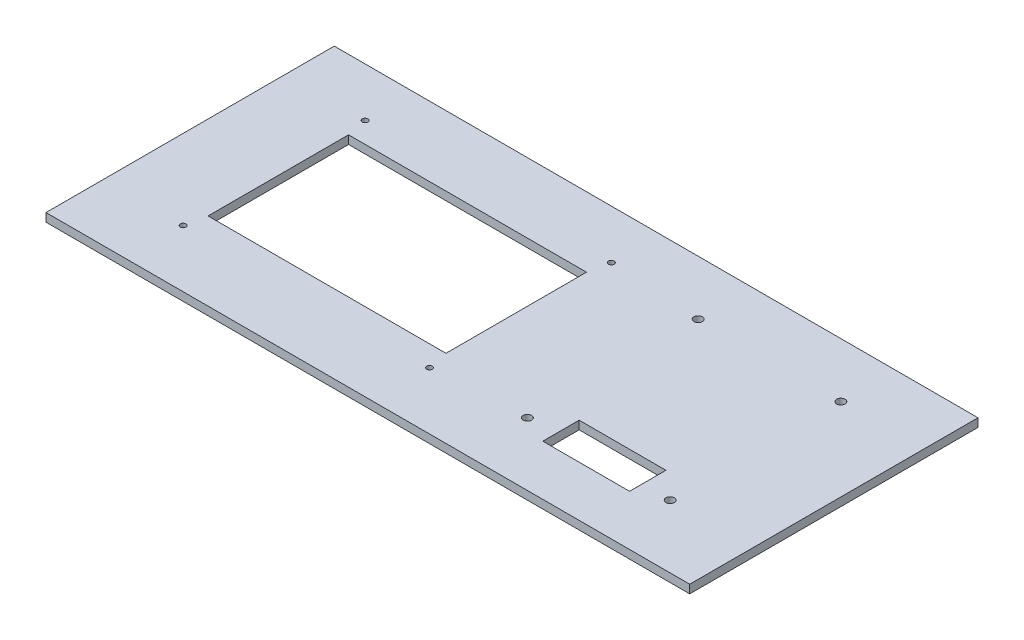
ISO-10303-21;
HEADER;
FILE_DESCRIPTION(('STEP AP214'),'2;1');
FILE_NAME('part.step','',(''),(''),'','','');
FILE_SCHEMA(('AUTOMOTIVE_DESIGN { 1 0 10303 214 1 1 1 1 }'));
ENDSEC;
DATA;
#1=APPLICATION_CONTEXT('core data for automotive mechanical design processes');
#2=APPLICATION_PROTOCOL_DEFINITION('international standard','automotive_design',2000,#1);
#3=PRODUCT_CONTEXT('',#1,'mechanical');
#4=PRODUCT('Part','Part','',(#3));
#5=PRODUCT_RELATED_PRODUCT_CATEGORY('part','',(#4));
#6=PRODUCT_DEFINITION_FORMATION('','',#4);
#7=PRODUCT_DEFINITION_CONTEXT('part definition',#1,'design');
#8=PRODUCT_DEFINITION('design','',#6,#7);
#9=PRODUCT_DEFINITION_SHAPE('','',#8);
#10=(LENGTH_UNIT() NAMED_UNIT(*) SI_UNIT(.MILLI.,.METRE.));
#11=(NAMED_UNIT(*) PLANE_ANGLE_UNIT() SI_UNIT($,.RADIAN.));
#12=(NAMED_UNIT(*) SI_UNIT($,.STERADIAN.) SOLID_ANGLE_UNIT());
#13=UNCERTAINTY_MEASURE_WITH_UNIT(LENGTH_MEASURE(1.E-05),#10,'distance_accuracy_value','');
#14=(GEOMETRIC_REPRESENTATION_CONTEXT(3) GLOBAL_UNCERTAINTY_ASSIGNED_CONTEXT((#13)) GLOBAL_UNIT_ASSIGNED_CONTEXT((#10,
#11,#12)) REPRESENTATION_CONTEXT('',''));
#15=CARTESIAN_POINT('',(0.,0.,0.));
#16=DIRECTION('',(0.,0.,1.));
#17=DIRECTION('',(1.,0.,0.));
#18=AXIS2_PLACEMENT_3D('',#15,#16,#17);
#19=CARTESIAN_POINT('',(-112.373595505618,3.,-69.3469101123596));
#20=DIRECTION('',(1.,0.,0.));
#21=DIRECTION('',(0.,0.,-1.));
#22=AXIS2_PLACEMENT_3D('',#19,#20,#21);
#23=PLANE('',#22);
#24=DIRECTION('',(0.,0.,1.));
#25=VECTOR('',#24,1.);
#26=CARTESIAN_POINT('',(-112.373595505618,0.,-69.3469101123596));
#27=LINE('',#26,#25);
#28=CARTESIAN_POINT('',(-112.373595505618,0.,-69.3469101123596));
#29=VERTEX_POINT('',#28);
#30=CARTESIAN_POINT('',(-112.373595505618,0.,33.6530898876404));
#31=VERTEX_POINT('',#30);
#32=EDGE_CURVE('E187',#29,#31,#27,.T.);
#33=ORIENTED_EDGE('',*,*,#32,.T.);
#34=DIRECTION('',(0.,-1.,0.));
#35=VECTOR('',#34,1.);
#36=CARTESIAN_POINT('',(-112.373595505618,3.,33.6530898876404));
#37=LINE('',#36,#35);
#38=CARTESIAN_POINT('',(-112.373595505618,3.,33.6530898876404));
#39=VERTEX_POINT('',#38);
#40=EDGE_CURVE('E11',#39,#31,#37,.T.);
#41=ORIENTED_EDGE('',*,*,#40,.F.);
#42=DIRECTION('',(0.,0.,1.));
#43=VECTOR('',#42,1.);
#44=CARTESIAN_POINT('',(-112.373595505618,3.,-69.3469101123596));
#45=LINE('',#44,#43);
#46=CARTESIAN_POINT('',(-112.373595505618,3.,-69.3469101123596));
#47=VERTEX_POINT('',#46);
#48=EDGE_CURVE('E194',#47,#39,#45,.T.);
#49=ORIENTED_EDGE('',*,*,#48,.F.);
#50=DIRECTION('',(0.,-1.,0.));
#51=VECTOR('',#50,1.);
#52=CARTESIAN_POINT('',(-112.373595505618,3.,-69.3469101123596));
#53=LINE('',#52,#51);
#54=EDGE_CURVE('E204',#47,#29,#53,.T.);
#55=ORIENTED_EDGE('',*,*,#54,.T.);
#56=EDGE_LOOP('',(#33,#41,#49,#55));
#57=FACE_BOUND('',#56,.T.);
#58=ADVANCED_FACE('F33',(#57),#23,.F.);
#59=CARTESIAN_POINT('',(-112.373595505618,3.,33.6530898876404));
#60=DIRECTION('',(0.,0.,-1.));
#61=DIRECTION('',(-1.,0.,0.));
#62=AXIS2_PLACEMENT_3D('',#59,#60,#61);
#63=PLANE('',#62);
#64=DIRECTION('',(1.,0.,0.));
#65=VECTOR('',#64,1.);
#66=CARTESIAN_POINT('',(-112.373595505618,0.,33.6530898876404));
#67=LINE('',#66,#65);
#68=CARTESIAN_POINT('',(117.626404494382,0.,33.6530898876404));
#69=VERTEX_POINT('',#68);
#70=EDGE_CURVE('E207',#31,#69,#67,.T.);
#71=ORIENTED_EDGE('',*,*,#70,.T.);
#72=DIRECTION('',(0.,-1.,0.));
#73=VECTOR('',#72,1.);
#74=CARTESIAN_POINT('',(117.626404494382,3.,33.6530898876404));
#75=LINE('',#74,#73);
#76=CARTESIAN_POINT('',(117.626404494382,3.,33.6530898876404));
#77=VERTEX_POINT('',#76);
#78=EDGE_CURVE('E40',#77,#69,#75,.T.);
#79=ORIENTED_EDGE('',*,*,#78,.F.);
#80=DIRECTION('',(1.,0.,0.));
#81=VECTOR('',#80,1.);
#82=CARTESIAN_POINT('',(-112.373595505618,3.,33.6530898876404));
#83=LINE('',#82,#81);
#84=EDGE_CURVE('E197',#39,#77,#83,.T.);
#85=ORIENTED_EDGE('',*,*,#84,.F.);
#86=ORIENTED_EDGE('',*,*,#40,.T.);
#87=EDGE_LOOP('',(#71,#79,#85,#86));
#88=FACE_BOUND('',#87,.T.);
#89=ADVANCED_FACE('F236',(#88),#63,.F.);
#90=CARTESIAN_POINT('',(117.626404494382,3.,-69.3469101123596));
#91=DIRECTION('',(-1.,0.,0.));
#92=DIRECTION('',(0.,0.,1.));
#93=AXIS2_PLACEMENT_3D('',#90,#91,#92);
#94=PLANE('',#93);
#95=DIRECTION('',(0.,0.,-1.));
#96=VECTOR('',#95,1.);
#97=CARTESIAN_POINT('',(117.626404494382,0.,-69.3469101123596));
#98=LINE('',#97,#96);
#99=CARTESIAN_POINT('',(117.626404494382,0.,-69.3469101123596));
#100=VERTEX_POINT('',#99);
#101=EDGE_CURVE('E209',#69,#100,#98,.T.);
#102=ORIENTED_EDGE('',*,*,#101,.T.);
#103=DIRECTION('',(0.,-1.,0.));
#104=VECTOR('',#103,1.);
#105=CARTESIAN_POINT('',(117.626404494382,3.,-69.3469101123596));
#106=LINE('',#105,#104);
#107=CARTESIAN_POINT('',(117.626404494382,3.,-69.3469101123596));
#108=VERTEX_POINT('',#107);
#109=EDGE_CURVE('E214',#108,#100,#106,.T.);
#110=ORIENTED_EDGE('',*,*,#109,.F.);
#111=DIRECTION('',(0.,0.,-1.));
#112=VECTOR('',#111,1.);
#113=CARTESIAN_POINT('',(117.626404494382,3.,-69.3469101123596));
#114=LINE('',#113,#112);
#115=EDGE_CURVE('E200',#77,#108,#114,.T.);
#116=ORIENTED_EDGE('',*,*,#115,.F.);
#117=ORIENTED_EDGE('',*,*,#78,.T.);
#118=EDGE_LOOP('',(#102,#110,#116,#117));
#119=FACE_BOUND('',#118,.T.);
#120=ADVANCED_FACE('F221',(#119),#94,.F.);
#121=CARTESIAN_POINT('',(-112.373595505618,3.,-69.3469101123596));
#122=DIRECTION('',(0.,0.,1.));
#123=DIRECTION('',(1.,0.,0.));
#124=AXIS2_PLACEMENT_3D('',#121,#122,#123);
#125=PLANE('',#124);
#126=DIRECTION('',(-1.,0.,0.));
#127=VECTOR('',#126,1.);
#128=CARTESIAN_POINT('',(-112.373595505618,0.,-69.3469101123596));
#129=LINE('',#128,#127);
#130=EDGE_CURVE('E198',#100,#29,#129,.T.);
#131=ORIENTED_EDGE('',*,*,#130,.T.);
#132=ORIENTED_EDGE('',*,*,#54,.F.);
#133=DIRECTION('',(-1.,0.,0.));
#134=VECTOR('',#133,1.);
#135=CARTESIAN_POINT('',(-112.373595505618,3.,-69.3469101123596));
#136=LINE('',#135,#134);
#137=EDGE_CURVE('E202',#108,#47,#136,.T.);
#138=ORIENTED_EDGE('',*,*,#137,.F.);
#139=ORIENTED_EDGE('',*,*,#109,.T.);
#140=EDGE_LOOP('',(#131,#132,#138,#139));
#141=FACE_BOUND('',#140,.T.);
#142=ADVANCED_FACE('F229',(#141),#125,.F.);
#143=CARTESIAN_POINT('',(0.,3.,0.));
#144=DIRECTION('',(0.,1.,0.));
#145=DIRECTION('',(0.,0.,1.));
#146=AXIS2_PLACEMENT_3D('',#143,#144,#145);
#147=PLANE('',#146);
#148=CARTESIAN_POINT('',(4.12640449438204,3.,13.1530898876404));
#149=DIRECTION('',(0.,1.,0.));
#150=DIRECTION('',(0.,0.,1.));
#151=AXIS2_PLACEMENT_3D('',#148,#149,#150);
#152=CIRCLE('',#151,1.);
#153=CARTESIAN_POINT('',(4.12640449438204,3.,14.1530898876404));
#154=VERTEX_POINT('',#153);
#155=EDGE_CURVE('E318',#154,#154,#152,.T.);
#156=ORIENTED_EDGE('',*,*,#155,.F.);
#157=EDGE_LOOP('',(#156));
#158=FACE_BOUND('',#157,.T.);
#159=CARTESIAN_POINT('',(-83.873595505618,3.,13.1530898876404));
#160=DIRECTION('',(0.,1.,0.));
#161=DIRECTION('',(0.,0.,1.));
#162=AXIS2_PLACEMENT_3D('',#159,#160,#161);
#163=CIRCLE('',#162,0.999999999999998);
#164=CARTESIAN_POINT('',(-83.873595505618,3.,14.1530898876404));
#165=VERTEX_POINT('',#164);
#166=EDGE_CURVE('E320',#165,#165,#163,.T.);
#167=ORIENTED_EDGE('',*,*,#166,.F.);
#168=EDGE_LOOP('',(#167));
#169=FACE_BOUND('',#168,.T.);
#170=CARTESIAN_POINT('',(4.12640449438204,3.,-51.8469101123596));
#171=DIRECTION('',(0.,1.,0.));
#172=DIRECTION('',(0.,0.,1.));
#173=AXIS2_PLACEMENT_3D('',#170,#171,#172);
#174=CIRCLE('',#173,1.);
#175=CARTESIAN_POINT('',(4.12640449438204,3.,-50.8469101123596));
#176=VERTEX_POINT('',#175);
#177=EDGE_CURVE('E326',#176,#176,#174,.T.);
#178=ORIENTED_EDGE('',*,*,#177,.F.);
#179=EDGE_LOOP('',(#178));
#180=FACE_BOUND('',#179,.T.);
#181=CARTESIAN_POINT('',(-83.873595505618,3.,-51.8469101123596));
#182=DIRECTION('',(0.,1.,0.));
#183=DIRECTION('',(0.,0.,1.));
#184=AXIS2_PLACEMENT_3D('',#181,#182,#183);
#185=CIRCLE('',#184,0.999999999999998);
#186=CARTESIAN_POINT('',(-83.873595505618,3.,-50.8469101123596));
#187=VERTEX_POINT('',#186);
#188=EDGE_CURVE('E332',#187,#187,#185,.T.);
#189=ORIENTED_EDGE('',*,*,#188,.F.);
#190=EDGE_LOOP('',(#189));
#191=FACE_BOUND('',#190,.T.);
#192=CARTESIAN_POINT('',(37.1264044943827,3.,11.1530898876404));
#193=DIRECTION('',(0.,1.,0.));
#194=DIRECTION('',(0.,0.,1.));
#195=AXIS2_PLACEMENT_3D('',#192,#193,#194);
#196=CIRCLE('',#195,1.5);
#197=CARTESIAN_POINT('',(37.1264044943827,3.,12.6530898876404));
#198=VERTEX_POINT('',#197);
#199=EDGE_CURVE('E338',#198,#198,#196,.T.);
#200=ORIENTED_EDGE('',*,*,#199,.F.);
#201=EDGE_LOOP('',(#200));
#202=FACE_BOUND('',#201,.T.);
#203=CARTESIAN_POINT('',(88.1264044943827,3.,11.1530898876404));
#204=DIRECTION('',(0.,1.,0.));
#205=DIRECTION('',(0.,0.,1.));
#206=AXIS2_PLACEMENT_3D('',#203,#204,#205);
#207=CIRCLE('',#206,1.5);
#208=CARTESIAN_POINT('',(88.1264044943827,3.,12.6530898876404));
#209=VERTEX_POINT('',#208);
#210=EDGE_CURVE('E344',#209,#209,#207,.T.);
#211=ORIENTED_EDGE('',*,*,#210,.F.);
#212=EDGE_LOOP('',(#211));
#213=FACE_BOUND('',#212,.T.);
#214=CARTESIAN_POINT('',(37.126404494382,3.,-49.8469101123596));
#215=DIRECTION('',(0.,1.,0.));
#216=DIRECTION('',(0.,0.,1.));
#217=AXIS2_PLACEMENT_3D('',#214,#215,#216);
#218=CIRCLE('',#217,1.5);
#219=CARTESIAN_POINT('',(37.126404494382,3.,-48.3469101123596));
#220=VERTEX_POINT('',#219);
#221=EDGE_CURVE('E350',#220,#220,#218,.T.);
#222=ORIENTED_EDGE('',*,*,#221,.F.);
#223=EDGE_LOOP('',(#222));
#224=FACE_BOUND('',#223,.T.);
#225=CARTESIAN_POINT('',(88.126404494382,3.,-49.8469101123596));
#226=DIRECTION('',(0.,1.,0.));
#227=DIRECTION('',(0.,0.,1.));
#228=AXIS2_PLACEMENT_3D('',#225,#226,#227);
#229=CIRCLE('',#228,1.5);
#230=CARTESIAN_POINT('',(88.126404494382,3.,-48.3469101123596));
#231=VERTEX_POINT('',#230);
#232=EDGE_CURVE('E145',#231,#231,#229,.T.);
#233=ORIENTED_EDGE('',*,*,#232,.F.);
#234=EDGE_LOOP('',(#233));
#235=FACE_BOUND('',#234,.T.);
#236=DIRECTION('',(0.,0.,1.));
#237=VECTOR('',#236,1.);
#238=CARTESIAN_POINT('',(47.1228483243827,3.,2.65308988764043));
#239=LINE('',#238,#237);
#240=CARTESIAN_POINT('',(47.1228483243827,3.,2.65308988764043));
#241=VERTEX_POINT('',#240);
#242=CARTESIAN_POINT('',(47.1228483243827,3.,15.6530898876404));
#243=VERTEX_POINT('',#242);
#244=EDGE_CURVE('E47',#241,#243,#239,.T.);
#245=ORIENTED_EDGE('',*,*,#244,.F.);
#246=DIRECTION('',(-1.,0.,0.));
#247=VECTOR('',#246,1.);
#248=CARTESIAN_POINT('',(47.1228483243827,3.,2.65308988764043));
#249=LINE('',#248,#247);
#250=CARTESIAN_POINT('',(78.1264044943827,3.,2.65308988764043));
#251=VERTEX_POINT('',#250);
#252=EDGE_CURVE('E139',#251,#241,#249,.T.);
#253=ORIENTED_EDGE('',*,*,#252,.F.);
#254=DIRECTION('',(0.,0.,-1.));
#255=VECTOR('',#254,1.);
#256=CARTESIAN_POINT('',(78.1264044943827,3.,2.65308988764043));
#257=LINE('',#256,#255);
#258=CARTESIAN_POINT('',(78.1264044943827,3.,15.6530898876404));
#259=VERTEX_POINT('',#258);
#260=EDGE_CURVE('E142',#259,#251,#257,.T.);
#261=ORIENTED_EDGE('',*,*,#260,.F.);
#262=DIRECTION('',(1.,0.,0.));
#263=VECTOR('',#262,1.);
#264=CARTESIAN_POINT('',(47.1228483243827,3.,15.6530898876404));
#265=LINE('',#264,#263);
#266=EDGE_CURVE('E151',#243,#259,#265,.T.);
#267=ORIENTED_EDGE('',*,*,#266,.F.);
#268=EDGE_LOOP('',(#245,#253,#261,#267));
#269=FACE_BOUND('',#268,.T.);
#270=DIRECTION('',(0.,0.,1.));
#271=VECTOR('',#270,1.);
#272=CARTESIAN_POINT('',(-82.373595505618,3.,-44.4469101123596));
#273=LINE('',#272,#271);
#274=CARTESIAN_POINT('',(-82.373595505618,3.,-44.4469101123596));
#275=VERTEX_POINT('',#274);
#276=CARTESIAN_POINT('',(-82.373595505618,3.,5.75308988764044));
#277=VERTEX_POINT('',#276);
#278=EDGE_CURVE('E158',#275,#277,#273,.T.);
#279=ORIENTED_EDGE('',*,*,#278,.F.);
#280=DIRECTION('',(-1.,0.,0.));
#281=VECTOR('',#280,1.);
#282=CARTESIAN_POINT('',(-82.373595505618,3.,-44.4469101123596));
#283=LINE('',#282,#281);
#284=CARTESIAN_POINT('',(2.62640449438203,3.,-44.4469101123596));
#285=VERTEX_POINT('',#284);
#286=EDGE_CURVE('E166',#285,#275,#283,.T.);
#287=ORIENTED_EDGE('',*,*,#286,.F.);
#288=DIRECTION('',(0.,0.,-1.));
#289=VECTOR('',#288,1.);
#290=CARTESIAN_POINT('',(2.62640449438203,3.,-44.4469101123596));
#291=LINE('',#290,#289);
#292=CARTESIAN_POINT('',(2.62640449438203,3.,5.75308988764044));
#293=VERTEX_POINT('',#292);
#294=EDGE_CURVE('E180',#293,#285,#291,.T.);
#295=ORIENTED_EDGE('',*,*,#294,.F.);
#296=DIRECTION('',(1.,0.,0.));
#297=VECTOR('',#296,1.);
#298=CARTESIAN_POINT('',(-82.373595505618,3.,5.75308988764044));
#299=LINE('',#298,#297);
#300=EDGE_CURVE('E177',#277,#293,#299,.T.);
#301=ORIENTED_EDGE('',*,*,#300,.F.);
#302=EDGE_LOOP('',(#279,#287,#295,#301));
#303=FACE_BOUND('',#302,.T.);
#304=ORIENTED_EDGE('',*,*,#48,.T.);
#305=ORIENTED_EDGE('',*,*,#84,.T.);
#306=ORIENTED_EDGE('',*,*,#115,.T.);
#307=ORIENTED_EDGE('',*,*,#137,.T.);
#308=EDGE_LOOP('',(#304,#305,#306,#307));
#309=FACE_BOUND('',#308,.T.);
#310=ADVANCED_FACE('F235',(#158,#169,#180,#191,#202,#213,#224,#235,#269,#303,#309),#147,.T.);
#311=CARTESIAN_POINT('',(0.,0.,0.));
#312=DIRECTION('',(0.,1.,0.));
#313=DIRECTION('',(0.,0.,1.));
#314=AXIS2_PLACEMENT_3D('',#311,#312,#313);
#315=PLANE('',#314);
#316=CARTESIAN_POINT('',(4.12640449438204,0.,13.1530898876404));
#317=DIRECTION('',(0.,1.,0.));
#318=DIRECTION('',(0.,0.,1.));
#319=AXIS2_PLACEMENT_3D('',#316,#317,#318);
#320=CIRCLE('',#319,1.);
#321=CARTESIAN_POINT('',(4.12640449438204,0.,14.1530898876404));
#322=VERTEX_POINT('',#321);
#323=EDGE_CURVE('E315',#322,#322,#320,.T.);
#324=ORIENTED_EDGE('',*,*,#323,.T.);
#325=EDGE_LOOP('',(#324));
#326=FACE_BOUND('',#325,.T.);
#327=CARTESIAN_POINT('',(-83.873595505618,0.,13.1530898876404));
#328=DIRECTION('',(0.,1.,0.));
#329=DIRECTION('',(0.,0.,1.));
#330=AXIS2_PLACEMENT_3D('',#327,#328,#329);
#331=CIRCLE('',#330,0.999999999999998);
#332=CARTESIAN_POINT('',(-83.873595505618,0.,14.1530898876404));
#333=VERTEX_POINT('',#332);
#334=EDGE_CURVE('E323',#333,#333,#331,.T.);
#335=ORIENTED_EDGE('',*,*,#334,.T.);
#336=EDGE_LOOP('',(#335));
#337=FACE_BOUND('',#336,.T.);
#338=CARTESIAN_POINT('',(4.12640449438204,0.,-51.8469101123596));
#339=DIRECTION('',(0.,1.,0.));
#340=DIRECTION('',(0.,0.,1.));
#341=AXIS2_PLACEMENT_3D('',#338,#339,#340);
#342=CIRCLE('',#341,1.);
#343=CARTESIAN_POINT('',(4.12640449438204,0.,-50.8469101123596));
#344=VERTEX_POINT('',#343);
#345=EDGE_CURVE('E329',#344,#344,#342,.T.);
#346=ORIENTED_EDGE('',*,*,#345,.T.);
#347=EDGE_LOOP('',(#346));
#348=FACE_BOUND('',#347,.T.);
#349=CARTESIAN_POINT('',(-83.873595505618,0.,-51.8469101123596));
#350=DIRECTION('',(0.,1.,0.));
#351=DIRECTION('',(0.,0.,1.));
#352=AXIS2_PLACEMENT_3D('',#349,#350,#351);
#353=CIRCLE('',#352,0.999999999999998);
#354=CARTESIAN_POINT('',(-83.873595505618,0.,-50.8469101123596));
#355=VERTEX_POINT('',#354);
#356=EDGE_CURVE('E335',#355,#355,#353,.T.);
#357=ORIENTED_EDGE('',*,*,#356,.T.);
#358=EDGE_LOOP('',(#357));
#359=FACE_BOUND('',#358,.T.);
#360=CARTESIAN_POINT('',(37.1264044943827,0.,11.1530898876404));
#361=DIRECTION('',(0.,1.,0.));
#362=DIRECTION('',(0.,0.,1.));
#363=AXIS2_PLACEMENT_3D('',#360,#361,#362);
#364=CIRCLE('',#363,1.5);
#365=CARTESIAN_POINT('',(37.1264044943827,0.,12.6530898876404));
#366=VERTEX_POINT('',#365);
#367=EDGE_CURVE('E341',#366,#366,#364,.T.);
#368=ORIENTED_EDGE('',*,*,#367,.T.);
#369=EDGE_LOOP('',(#368));
#370=FACE_BOUND('',#369,.T.);
#371=CARTESIAN_POINT('',(88.1264044943827,0.,11.1530898876404));
#372=DIRECTION('',(0.,1.,0.));
#373=DIRECTION('',(0.,0.,1.));
#374=AXIS2_PLACEMENT_3D('',#371,#372,#373);
#375=CIRCLE('',#374,1.5);
#376=CARTESIAN_POINT('',(88.1264044943827,0.,12.6530898876404));
#377=VERTEX_POINT('',#376);
#378=EDGE_CURVE('E347',#377,#377,#375,.T.);
#379=ORIENTED_EDGE('',*,*,#378,.T.);
#380=EDGE_LOOP('',(#379));
#381=FACE_BOUND('',#380,.T.);
#382=CARTESIAN_POINT('',(37.126404494382,0.,-49.8469101123596));
#383=DIRECTION('',(0.,1.,0.));
#384=DIRECTION('',(0.,0.,1.));
#385=AXIS2_PLACEMENT_3D('',#382,#383,#384);
#386=CIRCLE('',#385,1.5);
#387=CARTESIAN_POINT('',(37.126404494382,0.,-48.3469101123596));
#388=VERTEX_POINT('',#387);
#389=EDGE_CURVE('E353',#388,#388,#386,.T.);
#390=ORIENTED_EDGE('',*,*,#389,.T.);
#391=EDGE_LOOP('',(#390));
#392=FACE_BOUND('',#391,.T.);
#393=CARTESIAN_POINT('',(88.126404494382,0.,-49.8469101123596));
#394=DIRECTION('',(0.,1.,0.));
#395=DIRECTION('',(0.,0.,1.));
#396=AXIS2_PLACEMENT_3D('',#393,#394,#395);
#397=CIRCLE('',#396,1.5);
#398=CARTESIAN_POINT('',(88.126404494382,0.,-48.3469101123596));
#399=VERTEX_POINT('',#398);
#400=EDGE_CURVE('E152',#399,#399,#397,.T.);
#401=ORIENTED_EDGE('',*,*,#400,.T.);
#402=EDGE_LOOP('',(#401));
#403=FACE_BOUND('',#402,.T.);
#404=DIRECTION('',(-1.,0.,0.));
#405=VECTOR('',#404,1.);
#406=CARTESIAN_POINT('',(47.1228483243827,0.,2.65308988764043));
#407=LINE('',#406,#405);
#408=CARTESIAN_POINT('',(78.1264044943827,0.,2.65308988764043));
#409=VERTEX_POINT('',#408);
#410=CARTESIAN_POINT('',(47.1228483243827,0.,2.65308988764043));
#411=VERTEX_POINT('',#410);
#412=EDGE_CURVE('E129',#409,#411,#407,.T.);
#413=ORIENTED_EDGE('',*,*,#412,.T.);
#414=DIRECTION('',(0.,0.,1.));
#415=VECTOR('',#414,1.);
#416=CARTESIAN_POINT('',(47.1228483243827,0.,2.65308988764043));
#417=LINE('',#416,#415);
#418=CARTESIAN_POINT('',(47.1228483243827,0.,15.6530898876404));
#419=VERTEX_POINT('',#418);
#420=EDGE_CURVE('E123',#411,#419,#417,.T.);
#421=ORIENTED_EDGE('',*,*,#420,.T.);
#422=DIRECTION('',(1.,0.,0.));
#423=VECTOR('',#422,1.);
#424=CARTESIAN_POINT('',(47.1228483243827,0.,15.6530898876404));
#425=LINE('',#424,#423);
#426=CARTESIAN_POINT('',(78.1264044943827,0.,15.6530898876404));
#427=VERTEX_POINT('',#426);
#428=EDGE_CURVE('E132',#419,#427,#425,.T.);
#429=ORIENTED_EDGE('',*,*,#428,.T.);
#430=DIRECTION('',(0.,0.,-1.));
#431=VECTOR('',#430,1.);
#432=CARTESIAN_POINT('',(78.1264044943827,0.,2.65308988764043));
#433=LINE('',#432,#431);
#434=EDGE_CURVE('E55',#427,#409,#433,.T.);
#435=ORIENTED_EDGE('',*,*,#434,.T.);
#436=EDGE_LOOP('',(#413,#421,#429,#435));
#437=FACE_BOUND('',#436,.T.);
#438=DIRECTION('',(-1.,0.,0.));
#439=VECTOR('',#438,1.);
#440=CARTESIAN_POINT('',(-82.373595505618,0.,-44.4469101123596));
#441=LINE('',#440,#439);
#442=CARTESIAN_POINT('',(2.62640449438203,0.,-44.4469101123596));
#443=VERTEX_POINT('',#442);
#444=CARTESIAN_POINT('',(-82.373595505618,0.,-44.4469101123596));
#445=VERTEX_POINT('',#444);
#446=EDGE_CURVE('E172',#443,#445,#441,.T.);
#447=ORIENTED_EDGE('',*,*,#446,.T.);
#448=DIRECTION('',(0.,0.,1.));
#449=VECTOR('',#448,1.);
#450=CARTESIAN_POINT('',(-82.373595505618,0.,-44.4469101123596));
#451=LINE('',#450,#449);
#452=CARTESIAN_POINT('',(-82.373595505618,0.,5.75308988764044));
#453=VERTEX_POINT('',#452);
#454=EDGE_CURVE('E162',#445,#453,#451,.T.);
#455=ORIENTED_EDGE('',*,*,#454,.T.);
#456=DIRECTION('',(1.,0.,0.));
#457=VECTOR('',#456,1.);
#458=CARTESIAN_POINT('',(-82.373595505618,0.,5.75308988764044));
#459=LINE('',#458,#457);
#460=CARTESIAN_POINT('',(2.62640449438203,0.,5.75308988764044));
#461=VERTEX_POINT('',#460);
#462=EDGE_CURVE('E165',#453,#461,#459,.T.);
#463=ORIENTED_EDGE('',*,*,#462,.T.);
#464=DIRECTION('',(0.,0.,-1.));
#465=VECTOR('',#464,1.);
#466=CARTESIAN_POINT('',(2.62640449438203,0.,-44.4469101123596));
#467=LINE('',#466,#465);
#468=EDGE_CURVE('E169',#461,#443,#467,.T.);
#469=ORIENTED_EDGE('',*,*,#468,.T.);
#470=EDGE_LOOP('',(#447,#455,#463,#469));
#471=FACE_BOUND('',#470,.T.);
#472=ORIENTED_EDGE('',*,*,#32,.F.);
#473=ORIENTED_EDGE('',*,*,#130,.F.);
#474=ORIENTED_EDGE('',*,*,#101,.F.);
#475=ORIENTED_EDGE('',*,*,#70,.F.);
#476=EDGE_LOOP('',(#472,#473,#474,#475));
#477=FACE_BOUND('',#476,.T.);
#478=ADVANCED_FACE('F136',(#326,#337,#348,#359,#370,#381,#392,#403,#437,#471,#477),#315,.F.);
#479=CARTESIAN_POINT('',(-82.373595505618,0.,-44.4469101123596));
#480=DIRECTION('',(-1.,0.,0.));
#481=DIRECTION('',(0.,0.,1.));
#482=AXIS2_PLACEMENT_3D('',#479,#480,#481);
#483=PLANE('',#482);
#484=ORIENTED_EDGE('',*,*,#278,.T.);
#485=DIRECTION('',(0.,1.,0.));
#486=VECTOR('',#485,1.);
#487=CARTESIAN_POINT('',(-82.373595505618,0.,5.75308988764044));
#488=LINE('',#487,#486);
#489=EDGE_CURVE('E175',#453,#277,#488,.T.);
#490=ORIENTED_EDGE('',*,*,#489,.F.);
#491=ORIENTED_EDGE('',*,*,#454,.F.);
#492=DIRECTION('',(0.,1.,0.));
#493=VECTOR('',#492,1.);
#494=CARTESIAN_POINT('',(-82.373595505618,0.,-44.4469101123596));
#495=LINE('',#494,#493);
#496=EDGE_CURVE('E185',#445,#275,#495,.T.);
#497=ORIENTED_EDGE('',*,*,#496,.T.);
#498=EDGE_LOOP('',(#484,#490,#491,#497));
#499=FACE_BOUND('',#498,.T.);
#500=ADVANCED_FACE('F248',(#499),#483,.F.);
#501=CARTESIAN_POINT('',(-82.373595505618,0.,-44.4469101123596));
#502=DIRECTION('',(0.,0.,-1.));
#503=DIRECTION('',(-1.,0.,0.));
#504=AXIS2_PLACEMENT_3D('',#501,#502,#503);
#505=PLANE('',#504);
#506=ORIENTED_EDGE('',*,*,#286,.T.);
#507=ORIENTED_EDGE('',*,*,#496,.F.);
#508=ORIENTED_EDGE('',*,*,#446,.F.);
#509=DIRECTION('',(0.,1.,0.));
#510=VECTOR('',#509,1.);
#511=CARTESIAN_POINT('',(2.62640449438203,0.,-44.4469101123596));
#512=LINE('',#511,#510);
#513=EDGE_CURVE('E188',#443,#285,#512,.T.);
#514=ORIENTED_EDGE('',*,*,#513,.T.);
#515=EDGE_LOOP('',(#506,#507,#508,#514));
#516=FACE_BOUND('',#515,.T.);
#517=ADVANCED_FACE('F255',(#516),#505,.F.);
#518=CARTESIAN_POINT('',(2.62640449438203,0.,-44.4469101123596));
#519=DIRECTION('',(1.,0.,0.));
#520=DIRECTION('',(0.,0.,-1.));
#521=AXIS2_PLACEMENT_3D('',#518,#519,#520);
#522=PLANE('',#521);
#523=ORIENTED_EDGE('',*,*,#294,.T.);
#524=ORIENTED_EDGE('',*,*,#513,.F.);
#525=ORIENTED_EDGE('',*,*,#468,.F.);
#526=DIRECTION('',(0.,1.,0.));
#527=VECTOR('',#526,1.);
#528=CARTESIAN_POINT('',(2.62640449438203,0.,5.75308988764044));
#529=LINE('',#528,#527);
#530=EDGE_CURVE('E190',#461,#293,#529,.T.);
#531=ORIENTED_EDGE('',*,*,#530,.T.);
#532=EDGE_LOOP('',(#523,#524,#525,#531));
#533=FACE_BOUND('',#532,.T.);
#534=ADVANCED_FACE('F260',(#533),#522,.F.);
#535=CARTESIAN_POINT('',(-82.373595505618,0.,5.75308988764044));
#536=DIRECTION('',(0.,0.,1.));
#537=DIRECTION('',(1.,0.,0.));
#538=AXIS2_PLACEMENT_3D('',#535,#536,#537);
#539=PLANE('',#538);
#540=ORIENTED_EDGE('',*,*,#300,.T.);
#541=ORIENTED_EDGE('',*,*,#530,.F.);
#542=ORIENTED_EDGE('',*,*,#462,.F.);
#543=ORIENTED_EDGE('',*,*,#489,.T.);
#544=EDGE_LOOP('',(#540,#541,#542,#543));
#545=FACE_BOUND('',#544,.T.);
#546=ADVANCED_FACE('F257',(#545),#539,.F.);
#547=CARTESIAN_POINT('',(47.1228483243827,0.,2.65308988764043));
#548=DIRECTION('',(-1.,0.,0.));
#549=DIRECTION('',(0.,0.,1.));
#550=AXIS2_PLACEMENT_3D('',#547,#548,#549);
#551=PLANE('',#550);
#552=ORIENTED_EDGE('',*,*,#244,.T.);
#553=DIRECTION('',(0.,1.,0.));
#554=VECTOR('',#553,1.);
#555=CARTESIAN_POINT('',(47.1228483243827,0.,15.6530898876404));
#556=LINE('',#555,#554);
#557=EDGE_CURVE('E119',#419,#243,#556,.T.);
#558=ORIENTED_EDGE('',*,*,#557,.F.);
#559=ORIENTED_EDGE('',*,*,#420,.F.);
#560=DIRECTION('',(0.,1.,0.));
#561=VECTOR('',#560,1.);
#562=CARTESIAN_POINT('',(47.1228483243827,0.,2.65308988764043));
#563=LINE('',#562,#561);
#564=EDGE_CURVE('E156',#411,#241,#563,.T.);
#565=ORIENTED_EDGE('',*,*,#564,.T.);
#566=EDGE_LOOP('',(#552,#558,#559,#565));
#567=FACE_BOUND('',#566,.T.);
#568=ADVANCED_FACE('F121',(#567),#551,.F.);
#569=CARTESIAN_POINT('',(47.1228483243827,0.,2.65308988764043));
#570=DIRECTION('',(0.,0.,-1.));
#571=DIRECTION('',(-1.,0.,0.));
#572=AXIS2_PLACEMENT_3D('',#569,#570,#571);
#573=PLANE('',#572);
#574=ORIENTED_EDGE('',*,*,#252,.T.);
#575=ORIENTED_EDGE('',*,*,#564,.F.);
#576=ORIENTED_EDGE('',*,*,#412,.F.);
#577=DIRECTION('',(0.,1.,0.));
#578=VECTOR('',#577,1.);
#579=CARTESIAN_POINT('',(78.1264044943827,0.,2.65308988764043));
#580=LINE('',#579,#578);
#581=EDGE_CURVE('E159',#409,#251,#580,.T.);
#582=ORIENTED_EDGE('',*,*,#581,.T.);
#583=EDGE_LOOP('',(#574,#575,#576,#582));
#584=FACE_BOUND('',#583,.T.);
#585=ADVANCED_FACE('F270',(#584),#573,.F.);
#586=CARTESIAN_POINT('',(78.1264044943827,0.,2.65308988764043));
#587=DIRECTION('',(1.,0.,0.));
#588=DIRECTION('',(0.,0.,-1.));
#589=AXIS2_PLACEMENT_3D('',#586,#587,#588);
#590=PLANE('',#589);
#591=ORIENTED_EDGE('',*,*,#260,.T.);
#592=ORIENTED_EDGE('',*,*,#581,.F.);
#593=ORIENTED_EDGE('',*,*,#434,.F.);
#594=DIRECTION('',(0.,1.,0.));
#595=VECTOR('',#594,1.);
#596=CARTESIAN_POINT('',(78.1264044943827,0.,15.6530898876404));
#597=LINE('',#596,#595);
#598=EDGE_CURVE('E128',#427,#259,#597,.T.);
#599=ORIENTED_EDGE('',*,*,#598,.T.);
#600=EDGE_LOOP('',(#591,#592,#593,#599));
#601=FACE_BOUND('',#600,.T.);
#602=ADVANCED_FACE('F274',(#601),#590,.F.);
#603=CARTESIAN_POINT('',(47.1228483243827,0.,15.6530898876404));
#604=DIRECTION('',(0.,0.,1.));
#605=DIRECTION('',(1.,0.,0.));
#606=AXIS2_PLACEMENT_3D('',#603,#604,#605);
#607=PLANE('',#606);
#608=ORIENTED_EDGE('',*,*,#266,.T.);
#609=ORIENTED_EDGE('',*,*,#598,.F.);
#610=ORIENTED_EDGE('',*,*,#428,.F.);
#611=ORIENTED_EDGE('',*,*,#557,.T.);
#612=EDGE_LOOP('',(#608,#609,#610,#611));
#613=FACE_BOUND('',#612,.T.);
#614=ADVANCED_FACE('F133',(#613),#607,.F.);
#615=CARTESIAN_POINT('',(88.126404494382,0.,-49.8469101123596));
#616=DIRECTION('',(0.,1.,0.));
#617=DIRECTION('',(0.,0.,1.));
#618=AXIS2_PLACEMENT_3D('',#615,#616,#617);
#619=CYLINDRICAL_SURFACE('',#618,1.5);
#620=ORIENTED_EDGE('',*,*,#400,.F.);
#621=EDGE_LOOP('',(#620));
#622=FACE_BOUND('',#621,.T.);
#623=ORIENTED_EDGE('',*,*,#232,.T.);
#624=EDGE_LOOP('',(#623));
#625=FACE_BOUND('',#624,.T.);
#626=ADVANCED_FACE('F273',(#622,#625),#619,.F.);
#627=CARTESIAN_POINT('',(37.126404494382,0.,-49.8469101123596));
#628=DIRECTION('',(0.,1.,0.));
#629=DIRECTION('',(0.,0.,1.));
#630=AXIS2_PLACEMENT_3D('',#627,#628,#629);
#631=CYLINDRICAL_SURFACE('',#630,1.5);
#632=ORIENTED_EDGE('',*,*,#389,.F.);
#633=EDGE_LOOP('',(#632));
#634=FACE_BOUND('',#633,.T.);
#635=ORIENTED_EDGE('',*,*,#221,.T.);
#636=EDGE_LOOP('',(#635));
#637=FACE_BOUND('',#636,.T.);
#638=ADVANCED_FACE('F282',(#634,#637),#631,.F.);
#639=CARTESIAN_POINT('',(88.1264044943827,0.,11.1530898876404));
#640=DIRECTION('',(0.,1.,0.));
#641=DIRECTION('',(0.,0.,1.));
#642=AXIS2_PLACEMENT_3D('',#639,#640,#641);
#643=CYLINDRICAL_SURFACE('',#642,1.5);
#644=ORIENTED_EDGE('',*,*,#378,.F.);
#645=EDGE_LOOP('',(#644));
#646=FACE_BOUND('',#645,.T.);
#647=ORIENTED_EDGE('',*,*,#210,.T.);
#648=EDGE_LOOP('',(#647));
#649=FACE_BOUND('',#648,.T.);
#650=ADVANCED_FACE('F286',(#646,#649),#643,.F.);
#651=CARTESIAN_POINT('',(37.1264044943827,0.,11.1530898876404));
#652=DIRECTION('',(0.,1.,0.));
#653=DIRECTION('',(0.,0.,1.));
#654=AXIS2_PLACEMENT_3D('',#651,#652,#653);
#655=CYLINDRICAL_SURFACE('',#654,1.5);
#656=ORIENTED_EDGE('',*,*,#367,.F.);
#657=EDGE_LOOP('',(#656));
#658=FACE_BOUND('',#657,.T.);
#659=ORIENTED_EDGE('',*,*,#199,.T.);
#660=EDGE_LOOP('',(#659));
#661=FACE_BOUND('',#660,.T.);
#662=ADVANCED_FACE('F290',(#658,#661),#655,.F.);
#663=CARTESIAN_POINT('',(-83.873595505618,0.,-51.8469101123596));
#664=DIRECTION('',(0.,1.,0.));
#665=DIRECTION('',(0.,0.,1.));
#666=AXIS2_PLACEMENT_3D('',#663,#664,#665);
#667=CYLINDRICAL_SURFACE('',#666,0.999999999999998);
#668=ORIENTED_EDGE('',*,*,#356,.F.);
#669=EDGE_LOOP('',(#668));
#670=FACE_BOUND('',#669,.T.);
#671=ORIENTED_EDGE('',*,*,#188,.T.);
#672=EDGE_LOOP('',(#671));
#673=FACE_BOUND('',#672,.T.);
#674=ADVANCED_FACE('F294',(#670,#673),#667,.F.);
#675=CARTESIAN_POINT('',(4.12640449438204,0.,-51.8469101123596));
#676=DIRECTION('',(0.,1.,0.));
#677=DIRECTION('',(0.,0.,1.));
#678=AXIS2_PLACEMENT_3D('',#675,#676,#677);
#679=CYLINDRICAL_SURFACE('',#678,1.);
#680=ORIENTED_EDGE('',*,*,#345,.F.);
#681=EDGE_LOOP('',(#680));
#682=FACE_BOUND('',#681,.T.);
#683=ORIENTED_EDGE('',*,*,#177,.T.);
#684=EDGE_LOOP('',(#683));
#685=FACE_BOUND('',#684,.T.);
#686=ADVANCED_FACE('F298',(#682,#685),#679,.F.);
#687=CARTESIAN_POINT('',(-83.873595505618,0.,13.1530898876404));
#688=DIRECTION('',(0.,1.,0.));
#689=DIRECTION('',(0.,0.,1.));
#690=AXIS2_PLACEMENT_3D('',#687,#688,#689);
#691=CYLINDRICAL_SURFACE('',#690,0.999999999999998);
#692=ORIENTED_EDGE('',*,*,#334,.F.);
#693=EDGE_LOOP('',(#692));
#694=FACE_BOUND('',#693,.T.);
#695=ORIENTED_EDGE('',*,*,#166,.T.);
#696=EDGE_LOOP('',(#695));
#697=FACE_BOUND('',#696,.T.);
#698=ADVANCED_FACE('F302',(#694,#697),#691,.F.);
#699=CARTESIAN_POINT('',(4.12640449438204,0.,13.1530898876404));
#700=DIRECTION('',(0.,1.,0.));
#701=DIRECTION('',(0.,0.,1.));
#702=AXIS2_PLACEMENT_3D('',#699,#700,#701);
#703=CYLINDRICAL_SURFACE('',#702,1.);
#704=ORIENTED_EDGE('',*,*,#323,.F.);
#705=EDGE_LOOP('',(#704));
#706=FACE_BOUND('',#705,.T.);
#707=ORIENTED_EDGE('',*,*,#155,.T.);
#708=EDGE_LOOP('',(#707));
#709=FACE_BOUND('',#708,.T.);
#710=ADVANCED_FACE('F306',(#706,#709),#703,.F.);
#711=CLOSED_SHELL('',(#58,#89,#120,#142,#310,#478,#500,#517,#534,#546,#568,#585,#602,#614,#626,
#638,#650,#662,#674,#686,#698,#710));
#712=MANIFOLD_SOLID_BREP('B2',#711);
#713=ADVANCED_BREP_SHAPE_REPRESENTATION('',(#18,#712),#14);
#714=SHAPE_DEFINITION_REPRESENTATION(#9,#713);
ENDSEC;
END-ISO-10303-21;
